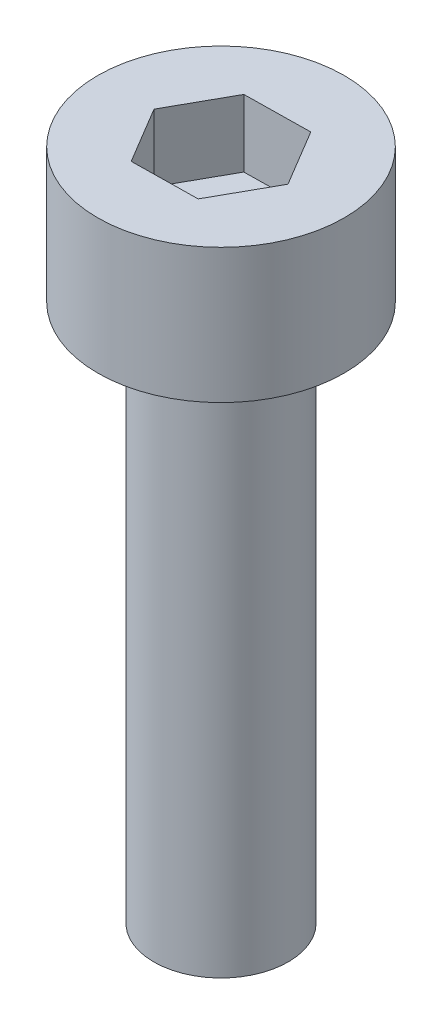
ISO-10303-21;
HEADER;
FILE_DESCRIPTION(('STEP AP214'),'2;1');
FILE_NAME('part.step','',(''),(''),'','','');
FILE_SCHEMA(('AUTOMOTIVE_DESIGN { 1 0 10303 214 1 1 1 1 }'));
ENDSEC;
DATA;
#1=APPLICATION_CONTEXT('core data for automotive mechanical design processes');
#2=APPLICATION_PROTOCOL_DEFINITION('international standard','automotive_design',2000,#1);
#3=PRODUCT_CONTEXT('',#1,'mechanical');
#4=PRODUCT('Part','Part','',(#3));
#5=PRODUCT_RELATED_PRODUCT_CATEGORY('part','',(#4));
#6=PRODUCT_DEFINITION_FORMATION('','',#4);
#7=PRODUCT_DEFINITION_CONTEXT('part definition',#1,'design');
#8=PRODUCT_DEFINITION('design','',#6,#7);
#9=PRODUCT_DEFINITION_SHAPE('','',#8);
#10=(LENGTH_UNIT() NAMED_UNIT(*) SI_UNIT(.MILLI.,.METRE.));
#11=(NAMED_UNIT(*) PLANE_ANGLE_UNIT() SI_UNIT($,.RADIAN.));
#12=(NAMED_UNIT(*) SI_UNIT($,.STERADIAN.) SOLID_ANGLE_UNIT());
#13=UNCERTAINTY_MEASURE_WITH_UNIT(LENGTH_MEASURE(1.E-05),#10,'distance_accuracy_value','');
#14=(GEOMETRIC_REPRESENTATION_CONTEXT(3) GLOBAL_UNCERTAINTY_ASSIGNED_CONTEXT((#13)) GLOBAL_UNIT_ASSIGNED_CONTEXT((#10,
#11,#12)) REPRESENTATION_CONTEXT('',''));
#15=CARTESIAN_POINT('',(0.,0.,0.));
#16=DIRECTION('',(0.,0.,1.));
#17=DIRECTION('',(1.,0.,0.));
#18=AXIS2_PLACEMENT_3D('',#15,#16,#17);
#19=CARTESIAN_POINT('',(0.,12.,0.));
#20=DIRECTION('',(0.,-1.,0.));
#21=DIRECTION('',(0.,0.,-1.));
#22=AXIS2_PLACEMENT_3D('',#19,#20,#21);
#23=CYLINDRICAL_SURFACE('',#22,1.5);
#24=CARTESIAN_POINT('',(0.,12.,0.));
#25=DIRECTION('',(0.,1.,0.));
#26=DIRECTION('',(0.,0.,1.));
#27=AXIS2_PLACEMENT_3D('',#24,#25,#26);
#28=CIRCLE('',#27,1.5);
#29=CARTESIAN_POINT('',(0.,12.,1.5));
#30=VERTEX_POINT('',#29);
#31=EDGE_CURVE('E11',#30,#30,#28,.T.);
#32=ORIENTED_EDGE('',*,*,#31,.F.);
#33=EDGE_LOOP('',(#32));
#34=FACE_BOUND('',#33,.T.);
#35=CARTESIAN_POINT('',(0.,0.,0.));
#36=DIRECTION('',(0.,1.,0.));
#37=DIRECTION('',(0.,0.,1.));
#38=AXIS2_PLACEMENT_3D('',#35,#36,#37);
#39=CIRCLE('',#38,1.5);
#40=CARTESIAN_POINT('',(0.,0.,1.5));
#41=VERTEX_POINT('',#40);
#42=EDGE_CURVE('E24',#41,#41,#39,.T.);
#43=ORIENTED_EDGE('',*,*,#42,.T.);
#44=EDGE_LOOP('',(#43));
#45=FACE_BOUND('',#44,.T.);
#46=ADVANCED_FACE('F17',(#34,#45),#23,.T.);
#47=CARTESIAN_POINT('',(0.,0.,0.));
#48=DIRECTION('',(0.,1.,0.));
#49=DIRECTION('',(0.,0.,1.));
#50=AXIS2_PLACEMENT_3D('',#47,#48,#49);
#51=PLANE('',#50);
#52=ORIENTED_EDGE('',*,*,#42,.F.);
#53=EDGE_LOOP('',(#52));
#54=FACE_BOUND('',#53,.T.);
#55=ADVANCED_FACE('F132',(#54),#51,.F.);
#56=CARTESIAN_POINT('',(0.,15.,0.));
#57=DIRECTION('',(0.,-1.,0.));
#58=DIRECTION('',(0.,0.,-1.));
#59=AXIS2_PLACEMENT_3D('',#56,#57,#58);
#60=CYLINDRICAL_SURFACE('',#59,2.75);
#61=CARTESIAN_POINT('',(0.,15.,0.));
#62=DIRECTION('',(0.,1.,0.));
#63=DIRECTION('',(0.,0.,1.));
#64=AXIS2_PLACEMENT_3D('',#61,#62,#63);
#65=CIRCLE('',#64,2.75);
#66=CARTESIAN_POINT('',(0.,15.,2.75));
#67=VERTEX_POINT('',#66);
#68=EDGE_CURVE('E126',#67,#67,#65,.T.);
#69=ORIENTED_EDGE('',*,*,#68,.F.);
#70=EDGE_LOOP('',(#69));
#71=FACE_BOUND('',#70,.T.);
#72=CARTESIAN_POINT('',(0.,12.,0.));
#73=DIRECTION('',(0.,1.,0.));
#74=DIRECTION('',(0.,0.,1.));
#75=AXIS2_PLACEMENT_3D('',#72,#73,#74);
#76=CIRCLE('',#75,2.75);
#77=CARTESIAN_POINT('',(0.,12.,2.75));
#78=VERTEX_POINT('',#77);
#79=EDGE_CURVE('E123',#78,#78,#76,.T.);
#80=ORIENTED_EDGE('',*,*,#79,.T.);
#81=EDGE_LOOP('',(#80));
#82=FACE_BOUND('',#81,.T.);
#83=ADVANCED_FACE('F134',(#71,#82),#60,.T.);
#84=CARTESIAN_POINT('',(0.,15.,0.));
#85=DIRECTION('',(0.,1.,0.));
#86=DIRECTION('',(0.,0.,1.));
#87=AXIS2_PLACEMENT_3D('',#84,#85,#86);
#88=PLANE('',#87);
#89=DIRECTION('',(0.999893086922528,0.,-0.0146224048821464));
#90=VECTOR('',#89,1.);
#91=CARTESIAN_POINT('',(-0.717399325967113,15.,1.28562755380473));
#92=LINE('',#91,#90);
#93=CARTESIAN_POINT('',(-0.717399325967113,15.,1.28562755380473));
#94=VERTEX_POINT('',#93);
#95=CARTESIAN_POINT('',(0.754686458416585,15.,1.26409981784772));
#96=VERTEX_POINT('',#95);
#97=EDGE_CURVE('E31',#94,#96,#92,.T.);
#98=ORIENTED_EDGE('',*,*,#97,.F.);
#99=DIRECTION('',(0.512609917553624,0.,0.858621611902278));
#100=VECTOR('',#99,1.);
#101=CARTESIAN_POINT('',(-1.4720857843837,15.,0.0215277359570126));
#102=LINE('',#101,#100);
#103=CARTESIAN_POINT('',(-1.4720857843837,15.,0.0215277359570126));
#104=VERTEX_POINT('',#103);
#105=EDGE_CURVE('E36',#104,#94,#102,.T.);
#106=ORIENTED_EDGE('',*,*,#105,.F.);
#107=DIRECTION('',(-0.487283169368904,0.,0.873244016784424));
#108=VECTOR('',#107,1.);
#109=CARTESIAN_POINT('',(-0.754686458416585,15.,-1.26409981784772));
#110=LINE('',#109,#108);
#111=CARTESIAN_POINT('',(-0.754686458416585,15.,-1.26409981784772));
#112=VERTEX_POINT('',#111);
#113=EDGE_CURVE('E118',#112,#104,#110,.T.);
#114=ORIENTED_EDGE('',*,*,#113,.F.);
#115=DIRECTION('',(-0.999893086922528,0.,0.0146224048821461));
#116=VECTOR('',#115,1.);
#117=CARTESIAN_POINT('',(0.717399325967112,15.,-1.28562755380473));
#118=LINE('',#117,#116);
#119=CARTESIAN_POINT('',(0.717399325967112,15.,-1.28562755380473));
#120=VERTEX_POINT('',#119);
#121=EDGE_CURVE('E115',#120,#112,#118,.T.);
#122=ORIENTED_EDGE('',*,*,#121,.F.);
#123=DIRECTION('',(-0.512609917553624,0.,-0.858621611902278));
#124=VECTOR('',#123,1.);
#125=CARTESIAN_POINT('',(1.4720857843837,15.,-0.0215277359570131));
#126=LINE('',#125,#124);
#127=CARTESIAN_POINT('',(1.4720857843837,15.,-0.0215277359570131));
#128=VERTEX_POINT('',#127);
#129=EDGE_CURVE('E113',#128,#120,#126,.T.);
#130=ORIENTED_EDGE('',*,*,#129,.F.);
#131=DIRECTION('',(0.487283169368904,0.,-0.873244016784425));
#132=VECTOR('',#131,1.);
#133=CARTESIAN_POINT('',(0.754686458416585,15.,1.26409981784772));
#134=LINE('',#133,#132);
#135=EDGE_CURVE('E87',#96,#128,#134,.T.);
#136=ORIENTED_EDGE('',*,*,#135,.F.);
#137=EDGE_LOOP('',(#98,#106,#114,#122,#130,#136));
#138=FACE_BOUND('',#137,.T.);
#139=ORIENTED_EDGE('',*,*,#68,.T.);
#140=EDGE_LOOP('',(#139));
#141=FACE_BOUND('',#140,.T.);
#142=ADVANCED_FACE('F140',(#138,#141),#88,.T.);
#143=CARTESIAN_POINT('',(0.,12.,0.));
#144=DIRECTION('',(0.,1.,0.));
#145=DIRECTION('',(0.,0.,1.));
#146=AXIS2_PLACEMENT_3D('',#143,#144,#145);
#147=PLANE('',#146);
#148=ORIENTED_EDGE('',*,*,#31,.T.);
#149=EDGE_LOOP('',(#148));
#150=FACE_BOUND('',#149,.T.);
#151=ORIENTED_EDGE('',*,*,#79,.F.);
#152=EDGE_LOOP('',(#151));
#153=FACE_BOUND('',#152,.T.);
#154=ADVANCED_FACE('F147',(#150,#153),#147,.F.);
#155=CARTESIAN_POINT('',(-0.717399325967113,13.5,1.28562755380473));
#156=DIRECTION('',(0.0146224048821464,0.,0.999893086922528));
#157=DIRECTION('',(0.999893086922528,0.,-0.0146224048821464));
#158=AXIS2_PLACEMENT_3D('',#155,#156,#157);
#159=PLANE('',#158);
#160=ORIENTED_EDGE('',*,*,#97,.T.);
#161=DIRECTION('',(0.,1.,0.));
#162=VECTOR('',#161,1.);
#163=CARTESIAN_POINT('',(0.754686458416585,13.5,1.26409981784772));
#164=LINE('',#163,#162);
#165=CARTESIAN_POINT('',(0.754686458416585,13.5,1.26409981784772));
#166=VERTEX_POINT('',#165);
#167=EDGE_CURVE('E110',#166,#96,#164,.T.);
#168=ORIENTED_EDGE('',*,*,#167,.F.);
#169=DIRECTION('',(0.999893086922528,0.,-0.0146224048821464));
#170=VECTOR('',#169,1.);
#171=CARTESIAN_POINT('',(-0.717399325967113,13.5,1.28562755380473));
#172=LINE('',#171,#170);
#173=CARTESIAN_POINT('',(-0.717399325967113,13.5,1.28562755380473));
#174=VERTEX_POINT('',#173);
#175=EDGE_CURVE('E91',#174,#166,#172,.T.);
#176=ORIENTED_EDGE('',*,*,#175,.F.);
#177=DIRECTION('',(0.,1.,0.));
#178=VECTOR('',#177,1.);
#179=CARTESIAN_POINT('',(-0.717399325967113,13.5,1.28562755380473));
#180=LINE('',#179,#178);
#181=EDGE_CURVE('E107',#174,#94,#180,.T.);
#182=ORIENTED_EDGE('',*,*,#181,.T.);
#183=EDGE_LOOP('',(#160,#168,#176,#182));
#184=FACE_BOUND('',#183,.T.);
#185=ADVANCED_FACE('F150',(#184),#159,.F.);
#186=CARTESIAN_POINT('',(-1.4720857843837,13.5,0.0215277359570126));
#187=DIRECTION('',(-0.858621611902278,0.,0.512609917553624));
#188=DIRECTION('',(0.512609917553624,0.,0.858621611902278));
#189=AXIS2_PLACEMENT_3D('',#186,#187,#188);
#190=PLANE('',#189);
#191=ORIENTED_EDGE('',*,*,#105,.T.);
#192=ORIENTED_EDGE('',*,*,#181,.F.);
#193=DIRECTION('',(0.512609917553624,0.,0.858621611902278));
#194=VECTOR('',#193,1.);
#195=CARTESIAN_POINT('',(-1.4720857843837,13.5,0.0215277359570126));
#196=LINE('',#195,#194);
#197=CARTESIAN_POINT('',(-1.4720857843837,13.5,0.0215277359570126));
#198=VERTEX_POINT('',#197);
#199=EDGE_CURVE('E105',#198,#174,#196,.T.);
#200=ORIENTED_EDGE('',*,*,#199,.F.);
#201=DIRECTION('',(0.,1.,0.));
#202=VECTOR('',#201,1.);
#203=CARTESIAN_POINT('',(-1.4720857843837,13.5,0.0215277359570126));
#204=LINE('',#203,#202);
#205=EDGE_CURVE('E103',#198,#104,#204,.T.);
#206=ORIENTED_EDGE('',*,*,#205,.T.);
#207=EDGE_LOOP('',(#191,#192,#200,#206));
#208=FACE_BOUND('',#207,.T.);
#209=ADVANCED_FACE('F154',(#208),#190,.F.);
#210=CARTESIAN_POINT('',(-0.754686458416585,13.5,-1.26409981784772));
#211=DIRECTION('',(-0.873244016784425,0.,-0.487283169368904));
#212=DIRECTION('',(-0.487283169368904,0.,0.873244016784425));
#213=AXIS2_PLACEMENT_3D('',#210,#211,#212);
#214=PLANE('',#213);
#215=ORIENTED_EDGE('',*,*,#113,.T.);
#216=ORIENTED_EDGE('',*,*,#205,.F.);
#217=DIRECTION('',(-0.487283169368904,0.,0.873244016784424));
#218=VECTOR('',#217,1.);
#219=CARTESIAN_POINT('',(-0.754686458416585,13.5,-1.26409981784772));
#220=LINE('',#219,#218);
#221=CARTESIAN_POINT('',(-0.754686458416585,13.5,-1.26409981784772));
#222=VERTEX_POINT('',#221);
#223=EDGE_CURVE('E100',#222,#198,#220,.T.);
#224=ORIENTED_EDGE('',*,*,#223,.F.);
#225=DIRECTION('',(0.,1.,0.));
#226=VECTOR('',#225,1.);
#227=CARTESIAN_POINT('',(-0.754686458416585,13.5,-1.26409981784772));
#228=LINE('',#227,#226);
#229=EDGE_CURVE('E97',#222,#112,#228,.T.);
#230=ORIENTED_EDGE('',*,*,#229,.T.);
#231=EDGE_LOOP('',(#215,#216,#224,#230));
#232=FACE_BOUND('',#231,.T.);
#233=ADVANCED_FACE('F158',(#232),#214,.F.);
#234=CARTESIAN_POINT('',(0.717399325967112,13.5,-1.28562755380473));
#235=DIRECTION('',(-0.0146224048821461,0.,-0.999893086922528));
#236=DIRECTION('',(-0.999893086922528,0.,0.0146224048821461));
#237=AXIS2_PLACEMENT_3D('',#234,#235,#236);
#238=PLANE('',#237);
#239=ORIENTED_EDGE('',*,*,#121,.T.);
#240=ORIENTED_EDGE('',*,*,#229,.F.);
#241=DIRECTION('',(-0.999893086922528,0.,0.0146224048821461));
#242=VECTOR('',#241,1.);
#243=CARTESIAN_POINT('',(0.717399325967112,13.5,-1.28562755380473));
#244=LINE('',#243,#242);
#245=CARTESIAN_POINT('',(0.717399325967112,13.5,-1.28562755380473));
#246=VERTEX_POINT('',#245);
#247=EDGE_CURVE('E95',#246,#222,#244,.T.);
#248=ORIENTED_EDGE('',*,*,#247,.F.);
#249=DIRECTION('',(0.,1.,0.));
#250=VECTOR('',#249,1.);
#251=CARTESIAN_POINT('',(0.717399325967112,13.5,-1.28562755380473));
#252=LINE('',#251,#250);
#253=EDGE_CURVE('E76',#246,#120,#252,.T.);
#254=ORIENTED_EDGE('',*,*,#253,.T.);
#255=EDGE_LOOP('',(#239,#240,#248,#254));
#256=FACE_BOUND('',#255,.T.);
#257=ADVANCED_FACE('F162',(#256),#238,.F.);
#258=CARTESIAN_POINT('',(1.4720857843837,13.5,-0.0215277359570131));
#259=DIRECTION('',(0.858621611902278,0.,-0.512609917553624));
#260=DIRECTION('',(-0.512609917553624,0.,-0.858621611902278));
#261=AXIS2_PLACEMENT_3D('',#258,#259,#260);
#262=PLANE('',#261);
#263=ORIENTED_EDGE('',*,*,#129,.T.);
#264=ORIENTED_EDGE('',*,*,#253,.F.);
#265=DIRECTION('',(-0.512609917553624,0.,-0.858621611902278));
#266=VECTOR('',#265,1.);
#267=CARTESIAN_POINT('',(1.4720857843837,13.5,-0.0215277359570131));
#268=LINE('',#267,#266);
#269=CARTESIAN_POINT('',(1.4720857843837,13.5,-0.0215277359570131));
#270=VERTEX_POINT('',#269);
#271=EDGE_CURVE('E69',#270,#246,#268,.T.);
#272=ORIENTED_EDGE('',*,*,#271,.F.);
#273=DIRECTION('',(0.,1.,0.));
#274=VECTOR('',#273,1.);
#275=CARTESIAN_POINT('',(1.4720857843837,13.5,-0.0215277359570131));
#276=LINE('',#275,#274);
#277=EDGE_CURVE('E73',#270,#128,#276,.T.);
#278=ORIENTED_EDGE('',*,*,#277,.T.);
#279=EDGE_LOOP('',(#263,#264,#272,#278));
#280=FACE_BOUND('',#279,.T.);
#281=ADVANCED_FACE('F72',(#280),#262,.F.);
#282=CARTESIAN_POINT('',(0.754686458416585,13.5,1.26409981784772));
#283=DIRECTION('',(0.873244016784425,0.,0.487283169368904));
#284=DIRECTION('',(0.487283169368904,0.,-0.873244016784425));
#285=AXIS2_PLACEMENT_3D('',#282,#283,#284);
#286=PLANE('',#285);
#287=ORIENTED_EDGE('',*,*,#135,.T.);
#288=ORIENTED_EDGE('',*,*,#277,.F.);
#289=DIRECTION('',(0.487283169368904,0.,-0.873244016784425));
#290=VECTOR('',#289,1.);
#291=CARTESIAN_POINT('',(0.754686458416585,13.5,1.26409981784772));
#292=LINE('',#291,#290);
#293=EDGE_CURVE('E85',#166,#270,#292,.T.);
#294=ORIENTED_EDGE('',*,*,#293,.F.);
#295=ORIENTED_EDGE('',*,*,#167,.T.);
#296=EDGE_LOOP('',(#287,#288,#294,#295));
#297=FACE_BOUND('',#296,.T.);
#298=ADVANCED_FACE('F83',(#297),#286,.F.);
#299=CARTESIAN_POINT('',(0.,13.5,0.));
#300=DIRECTION('',(0.,1.,0.));
#301=DIRECTION('',(0.,0.,1.));
#302=AXIS2_PLACEMENT_3D('',#299,#300,#301);
#303=PLANE('',#302);
#304=ORIENTED_EDGE('',*,*,#175,.T.);
#305=ORIENTED_EDGE('',*,*,#293,.T.);
#306=ORIENTED_EDGE('',*,*,#271,.T.);
#307=ORIENTED_EDGE('',*,*,#247,.T.);
#308=ORIENTED_EDGE('',*,*,#223,.T.);
#309=ORIENTED_EDGE('',*,*,#199,.T.);
#310=EDGE_LOOP('',(#304,#305,#306,#307,#308,#309));
#311=FACE_BOUND('',#310,.T.);
#312=ADVANCED_FACE('F89',(#311),#303,.T.);
#313=CLOSED_SHELL('',(#46,#55,#83,#142,#154,#185,#209,#233,#257,#281,#298,#312));
#314=MANIFOLD_SOLID_BREP('B1',#313);
#315=ADVANCED_BREP_SHAPE_REPRESENTATION('',(#18,#314),#14);
#316=SHAPE_DEFINITION_REPRESENTATION(#9,#315);
ENDSEC;
END-ISO-10303-21;
